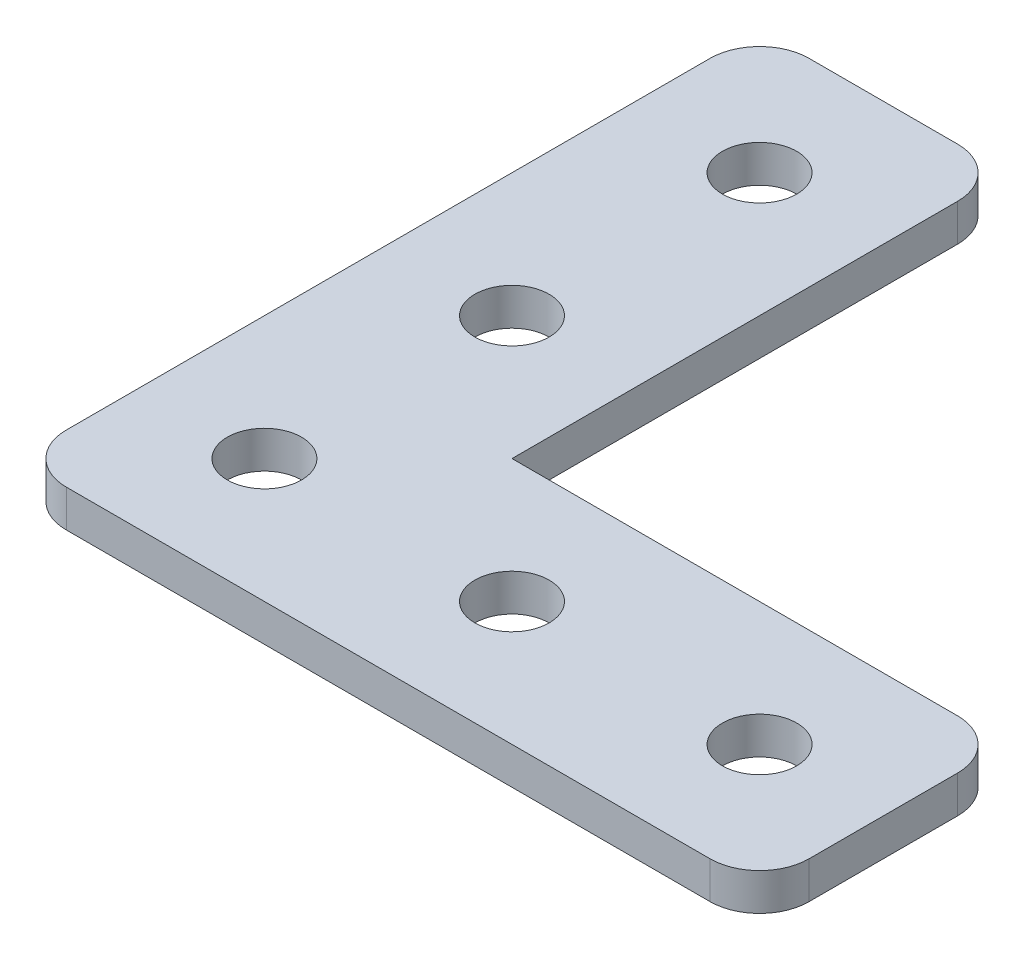
ISO-10303-21;
HEADER;
FILE_DESCRIPTION(('STEP AP214'),'2;1');
FILE_NAME('part.step','',(''),(''),'','','');
FILE_SCHEMA(('AUTOMOTIVE_DESIGN { 1 0 10303 214 1 1 1 1 }'));
ENDSEC;
DATA;
#1=APPLICATION_CONTEXT('core data for automotive mechanical design processes');
#2=APPLICATION_PROTOCOL_DEFINITION('international standard','automotive_design',2000,#1);
#3=PRODUCT_CONTEXT('',#1,'mechanical');
#4=PRODUCT('Part','Part','',(#3));
#5=PRODUCT_RELATED_PRODUCT_CATEGORY('part','',(#4));
#6=PRODUCT_DEFINITION_FORMATION('','',#4);
#7=PRODUCT_DEFINITION_CONTEXT('part definition',#1,'design');
#8=PRODUCT_DEFINITION('design','',#6,#7);
#9=PRODUCT_DEFINITION_SHAPE('','',#8);
#10=(LENGTH_UNIT() NAMED_UNIT(*) SI_UNIT(.MILLI.,.METRE.));
#11=(NAMED_UNIT(*) PLANE_ANGLE_UNIT() SI_UNIT($,.RADIAN.));
#12=(NAMED_UNIT(*) SI_UNIT($,.STERADIAN.) SOLID_ANGLE_UNIT());
#13=UNCERTAINTY_MEASURE_WITH_UNIT(LENGTH_MEASURE(1.E-05),#10,'distance_accuracy_value','');
#14=(GEOMETRIC_REPRESENTATION_CONTEXT(3) GLOBAL_UNCERTAINTY_ASSIGNED_CONTEXT((#13)) GLOBAL_UNIT_ASSIGNED_CONTEXT((#10,
#11,#12)) REPRESENTATION_CONTEXT('',''));
#15=CARTESIAN_POINT('',(0.,0.,0.));
#16=DIRECTION('',(0.,0.,1.));
#17=DIRECTION('',(1.,0.,0.));
#18=AXIS2_PLACEMENT_3D('',#15,#16,#17);
#19=CARTESIAN_POINT('',(0.,1.5,-10.));
#20=DIRECTION('',(0.,0.,-1.));
#21=DIRECTION('',(-1.,0.,0.));
#22=AXIS2_PLACEMENT_3D('',#19,#20,#21);
#23=PLANE('',#22);
#24=DIRECTION('',(1.,0.,0.));
#25=VECTOR('',#24,1.);
#26=CARTESIAN_POINT('',(0.,1.5,-10.));
#27=LINE('',#26,#25);
#28=CARTESIAN_POINT('',(10.,1.5,-10.));
#29=VERTEX_POINT('',#28);
#30=CARTESIAN_POINT('',(28.,1.5,-10.));
#31=VERTEX_POINT('',#30);
#32=EDGE_CURVE('E136',#29,#31,#27,.T.);
#33=ORIENTED_EDGE('',*,*,#32,.T.);
#34=DIRECTION('',(0.,-1.,0.));
#35=VECTOR('',#34,1.);
#36=CARTESIAN_POINT('',(28.,0.,-10.));
#37=LINE('',#36,#35);
#38=CARTESIAN_POINT('',(28.,0.,-10.));
#39=VERTEX_POINT('',#38);
#40=EDGE_CURVE('E144',#31,#39,#37,.T.);
#41=ORIENTED_EDGE('',*,*,#40,.T.);
#42=DIRECTION('',(1.,0.,0.));
#43=VECTOR('',#42,1.);
#44=CARTESIAN_POINT('',(0.,0.,-10.));
#45=LINE('',#44,#43);
#46=CARTESIAN_POINT('',(10.,0.,-10.));
#47=VERTEX_POINT('',#46);
#48=EDGE_CURVE('E143',#47,#39,#45,.T.);
#49=ORIENTED_EDGE('',*,*,#48,.F.);
#50=DIRECTION('',(0.,-1.,0.));
#51=VECTOR('',#50,1.);
#52=CARTESIAN_POINT('',(10.,1.5,-10.));
#53=LINE('',#52,#51);
#54=EDGE_CURVE('E129',#29,#47,#53,.T.);
#55=ORIENTED_EDGE('',*,*,#54,.F.);
#56=EDGE_LOOP('',(#33,#41,#49,#55));
#57=FACE_BOUND('',#56,.T.);
#58=ADVANCED_FACE('F41',(#57),#23,.T.);
#59=CARTESIAN_POINT('',(10.,1.5,0.));
#60=DIRECTION('',(1.,0.,0.));
#61=DIRECTION('',(0.,0.,-1.));
#62=AXIS2_PLACEMENT_3D('',#59,#60,#61);
#63=PLANE('',#62);
#64=DIRECTION('',(0.,0.,1.));
#65=VECTOR('',#64,1.);
#66=CARTESIAN_POINT('',(10.,0.,0.));
#67=LINE('',#66,#65);
#68=CARTESIAN_POINT('',(10.,0.,-28.));
#69=VERTEX_POINT('',#68);
#70=EDGE_CURVE('E294',#69,#47,#67,.T.);
#71=ORIENTED_EDGE('',*,*,#70,.F.);
#72=DIRECTION('',(0.,-1.,0.));
#73=VECTOR('',#72,1.);
#74=CARTESIAN_POINT('',(10.,1.5,-28.));
#75=LINE('',#74,#73);
#76=CARTESIAN_POINT('',(10.,1.5,-28.));
#77=VERTEX_POINT('',#76);
#78=EDGE_CURVE('E12',#69,#77,#75,.F.);
#79=ORIENTED_EDGE('',*,*,#78,.T.);
#80=DIRECTION('',(0.,0.,1.));
#81=VECTOR('',#80,1.);
#82=CARTESIAN_POINT('',(10.,1.5,0.));
#83=LINE('',#82,#81);
#84=EDGE_CURVE('E125',#77,#29,#83,.T.);
#85=ORIENTED_EDGE('',*,*,#84,.T.);
#86=ORIENTED_EDGE('',*,*,#54,.T.);
#87=EDGE_LOOP('',(#71,#79,#85,#86));
#88=FACE_BOUND('',#87,.T.);
#89=ADVANCED_FACE('F128',(#88),#63,.T.);
#90=CARTESIAN_POINT('',(0.,1.5,-30.));
#91=DIRECTION('',(0.,0.,1.));
#92=DIRECTION('',(1.,0.,0.));
#93=AXIS2_PLACEMENT_3D('',#90,#91,#92);
#94=PLANE('',#93);
#95=DIRECTION('',(-1.,0.,0.));
#96=VECTOR('',#95,1.);
#97=CARTESIAN_POINT('',(0.,0.,-30.));
#98=LINE('',#97,#96);
#99=CARTESIAN_POINT('',(8.,0.,-30.));
#100=VERTEX_POINT('',#99);
#101=CARTESIAN_POINT('',(2.,0.,-30.));
#102=VERTEX_POINT('',#101);
#103=EDGE_CURVE('E274',#100,#102,#98,.T.);
#104=ORIENTED_EDGE('',*,*,#103,.T.);
#105=DIRECTION('',(0.,-1.,0.));
#106=VECTOR('',#105,1.);
#107=CARTESIAN_POINT('',(2.,1.5,-30.));
#108=LINE('',#107,#106);
#109=CARTESIAN_POINT('',(2.,1.5,-30.));
#110=VERTEX_POINT('',#109);
#111=EDGE_CURVE('E49',#102,#110,#108,.F.);
#112=ORIENTED_EDGE('',*,*,#111,.T.);
#113=DIRECTION('',(-1.,0.,0.));
#114=VECTOR('',#113,1.);
#115=CARTESIAN_POINT('',(0.,1.5,-30.));
#116=LINE('',#115,#114);
#117=CARTESIAN_POINT('',(8.,1.5,-30.));
#118=VERTEX_POINT('',#117);
#119=EDGE_CURVE('E135',#118,#110,#116,.T.);
#120=ORIENTED_EDGE('',*,*,#119,.F.);
#121=DIRECTION('',(0.,-1.,0.));
#122=VECTOR('',#121,1.);
#123=CARTESIAN_POINT('',(8.,0.,-30.));
#124=LINE('',#123,#122);
#125=EDGE_CURVE('E264',#118,#100,#124,.T.);
#126=ORIENTED_EDGE('',*,*,#125,.T.);
#127=EDGE_LOOP('',(#104,#112,#120,#126));
#128=FACE_BOUND('',#127,.T.);
#129=ADVANCED_FACE('F271',(#128),#94,.F.);
#130=CARTESIAN_POINT('',(0.,1.5,0.));
#131=DIRECTION('',(1.,0.,0.));
#132=DIRECTION('',(0.,0.,-1.));
#133=AXIS2_PLACEMENT_3D('',#130,#131,#132);
#134=PLANE('',#133);
#135=DIRECTION('',(0.,0.,1.));
#136=VECTOR('',#135,1.);
#137=CARTESIAN_POINT('',(0.,0.,0.));
#138=LINE('',#137,#136);
#139=CARTESIAN_POINT('',(0.,0.,-28.));
#140=VERTEX_POINT('',#139);
#141=CARTESIAN_POINT('',(0.,0.,-2.));
#142=VERTEX_POINT('',#141);
#143=EDGE_CURVE('E285',#140,#142,#138,.T.);
#144=ORIENTED_EDGE('',*,*,#143,.T.);
#145=DIRECTION('',(0.,-1.,0.));
#146=VECTOR('',#145,1.);
#147=CARTESIAN_POINT('',(0.,1.5,-2.));
#148=LINE('',#147,#146);
#149=CARTESIAN_POINT('',(0.,1.5,-2.));
#150=VERTEX_POINT('',#149);
#151=EDGE_CURVE('E262',#142,#150,#148,.F.);
#152=ORIENTED_EDGE('',*,*,#151,.T.);
#153=DIRECTION('',(0.,0.,1.));
#154=VECTOR('',#153,1.);
#155=CARTESIAN_POINT('',(0.,1.5,0.));
#156=LINE('',#155,#154);
#157=CARTESIAN_POINT('',(0.,1.5,-28.));
#158=VERTEX_POINT('',#157);
#159=EDGE_CURVE('E192',#158,#150,#156,.T.);
#160=ORIENTED_EDGE('',*,*,#159,.F.);
#161=DIRECTION('',(0.,-1.,0.));
#162=VECTOR('',#161,1.);
#163=CARTESIAN_POINT('',(0.,1.5,-28.));
#164=LINE('',#163,#162);
#165=EDGE_CURVE('E259',#158,#140,#164,.T.);
#166=ORIENTED_EDGE('',*,*,#165,.T.);
#167=EDGE_LOOP('',(#144,#152,#160,#166));
#168=FACE_BOUND('',#167,.T.);
#169=ADVANCED_FACE('F284',(#168),#134,.F.);
#170=CARTESIAN_POINT('',(0.,1.5,0.));
#171=DIRECTION('',(0.,0.,-1.));
#172=DIRECTION('',(-1.,0.,0.));
#173=AXIS2_PLACEMENT_3D('',#170,#171,#172);
#174=PLANE('',#173);
#175=DIRECTION('',(1.,0.,0.));
#176=VECTOR('',#175,1.);
#177=CARTESIAN_POINT('',(0.,1.5,0.));
#178=LINE('',#177,#176);
#179=CARTESIAN_POINT('',(2.,1.5,0.));
#180=VERTEX_POINT('',#179);
#181=CARTESIAN_POINT('',(28.,1.5,0.));
#182=VERTEX_POINT('',#181);
#183=EDGE_CURVE('E196',#180,#182,#178,.T.);
#184=ORIENTED_EDGE('',*,*,#183,.F.);
#185=DIRECTION('',(0.,-1.,0.));
#186=VECTOR('',#185,1.);
#187=CARTESIAN_POINT('',(2.,1.5,0.));
#188=LINE('',#187,#186);
#189=CARTESIAN_POINT('',(2.,0.,0.));
#190=VERTEX_POINT('',#189);
#191=EDGE_CURVE('E251',#180,#190,#188,.T.);
#192=ORIENTED_EDGE('',*,*,#191,.T.);
#193=DIRECTION('',(1.,0.,0.));
#194=VECTOR('',#193,1.);
#195=CARTESIAN_POINT('',(0.,0.,0.));
#196=LINE('',#195,#194);
#197=CARTESIAN_POINT('',(28.,0.,0.));
#198=VERTEX_POINT('',#197);
#199=EDGE_CURVE('E291',#190,#198,#196,.T.);
#200=ORIENTED_EDGE('',*,*,#199,.T.);
#201=DIRECTION('',(0.,-1.,0.));
#202=VECTOR('',#201,1.);
#203=CARTESIAN_POINT('',(28.,1.5,0.));
#204=LINE('',#203,#202);
#205=EDGE_CURVE('E56',#198,#182,#204,.F.);
#206=ORIENTED_EDGE('',*,*,#205,.T.);
#207=EDGE_LOOP('',(#184,#192,#200,#206));
#208=FACE_BOUND('',#207,.T.);
#209=ADVANCED_FACE('F366',(#208),#174,.F.);
#210=CARTESIAN_POINT('',(15.,1.5,-5.));
#211=DIRECTION('',(0.,-1.,0.));
#212=DIRECTION('',(0.,0.,-1.));
#213=AXIS2_PLACEMENT_3D('',#210,#211,#212);
#214=CYLINDRICAL_SURFACE('',#213,1.5);
#215=CARTESIAN_POINT('',(15.,1.5,-5.));
#216=DIRECTION('',(0.,1.,0.));
#217=DIRECTION('',(0.,0.,1.));
#218=AXIS2_PLACEMENT_3D('',#215,#216,#217);
#219=CIRCLE('',#218,1.5);
#220=CARTESIAN_POINT('',(15.,1.5,-3.5));
#221=VERTEX_POINT('',#220);
#222=EDGE_CURVE('E204',#221,#221,#219,.T.);
#223=ORIENTED_EDGE('',*,*,#222,.T.);
#224=EDGE_LOOP('',(#223));
#225=FACE_BOUND('',#224,.T.);
#226=CARTESIAN_POINT('',(15.,0.,-5.));
#227=DIRECTION('',(0.,1.,0.));
#228=DIRECTION('',(0.,0.,1.));
#229=AXIS2_PLACEMENT_3D('',#226,#227,#228);
#230=CIRCLE('',#229,1.5);
#231=CARTESIAN_POINT('',(15.,0.,-3.5));
#232=VERTEX_POINT('',#231);
#233=EDGE_CURVE('E220',#232,#232,#230,.T.);
#234=ORIENTED_EDGE('',*,*,#233,.F.);
#235=EDGE_LOOP('',(#234));
#236=FACE_BOUND('',#235,.T.);
#237=ADVANCED_FACE('F316',(#225,#236),#214,.F.);
#238=CARTESIAN_POINT('',(30.,1.5,0.));
#239=DIRECTION('',(-1.,0.,0.));
#240=DIRECTION('',(0.,0.,1.));
#241=AXIS2_PLACEMENT_3D('',#238,#239,#240);
#242=PLANE('',#241);
#243=DIRECTION('',(0.,0.,-1.));
#244=VECTOR('',#243,1.);
#245=CARTESIAN_POINT('',(30.,0.,0.));
#246=LINE('',#245,#244);
#247=CARTESIAN_POINT('',(30.,0.,-2.));
#248=VERTEX_POINT('',#247);
#249=CARTESIAN_POINT('',(30.,0.,-8.));
#250=VERTEX_POINT('',#249);
#251=EDGE_CURVE('E225',#248,#250,#246,.T.);
#252=ORIENTED_EDGE('',*,*,#251,.T.);
#253=DIRECTION('',(0.,-1.,0.));
#254=VECTOR('',#253,1.);
#255=CARTESIAN_POINT('',(30.,1.5,-8.));
#256=LINE('',#255,#254);
#257=CARTESIAN_POINT('',(30.,1.5,-8.));
#258=VERTEX_POINT('',#257);
#259=EDGE_CURVE('E180',#250,#258,#256,.F.);
#260=ORIENTED_EDGE('',*,*,#259,.T.);
#261=DIRECTION('',(0.,0.,-1.));
#262=VECTOR('',#261,1.);
#263=CARTESIAN_POINT('',(30.,1.5,0.));
#264=LINE('',#263,#262);
#265=CARTESIAN_POINT('',(30.,1.5,-2.));
#266=VERTEX_POINT('',#265);
#267=EDGE_CURVE('E201',#266,#258,#264,.T.);
#268=ORIENTED_EDGE('',*,*,#267,.F.);
#269=DIRECTION('',(0.,-1.,0.));
#270=VECTOR('',#269,1.);
#271=CARTESIAN_POINT('',(30.,1.5,-2.));
#272=LINE('',#271,#270);
#273=EDGE_CURVE('E239',#266,#248,#272,.T.);
#274=ORIENTED_EDGE('',*,*,#273,.T.);
#275=EDGE_LOOP('',(#252,#260,#268,#274));
#276=FACE_BOUND('',#275,.T.);
#277=ADVANCED_FACE('F247',(#276),#242,.F.);
#278=CARTESIAN_POINT('',(5.,1.5,-5.));
#279=DIRECTION('',(0.,-1.,0.));
#280=DIRECTION('',(0.,0.,-1.));
#281=AXIS2_PLACEMENT_3D('',#278,#279,#280);
#282=CYLINDRICAL_SURFACE('',#281,1.5);
#283=CARTESIAN_POINT('',(5.,1.5,-5.));
#284=DIRECTION('',(0.,1.,0.));
#285=DIRECTION('',(0.,0.,1.));
#286=AXIS2_PLACEMENT_3D('',#283,#284,#285);
#287=CIRCLE('',#286,1.5);
#288=CARTESIAN_POINT('',(5.,1.5,-3.5));
#289=VERTEX_POINT('',#288);
#290=EDGE_CURVE('E153',#289,#289,#287,.T.);
#291=ORIENTED_EDGE('',*,*,#290,.T.);
#292=EDGE_LOOP('',(#291));
#293=FACE_BOUND('',#292,.T.);
#294=CARTESIAN_POINT('',(5.,0.,-5.));
#295=DIRECTION('',(0.,1.,0.));
#296=DIRECTION('',(0.,0.,1.));
#297=AXIS2_PLACEMENT_3D('',#294,#295,#296);
#298=CIRCLE('',#297,1.5);
#299=CARTESIAN_POINT('',(5.,0.,-3.5));
#300=VERTEX_POINT('',#299);
#301=EDGE_CURVE('E299',#300,#300,#298,.T.);
#302=ORIENTED_EDGE('',*,*,#301,.F.);
#303=EDGE_LOOP('',(#302));
#304=FACE_BOUND('',#303,.T.);
#305=ADVANCED_FACE('F339',(#293,#304),#282,.F.);
#306=CARTESIAN_POINT('',(25.,1.5,-5.));
#307=DIRECTION('',(0.,-1.,0.));
#308=DIRECTION('',(0.,0.,-1.));
#309=AXIS2_PLACEMENT_3D('',#306,#307,#308);
#310=CYLINDRICAL_SURFACE('',#309,1.5);
#311=CARTESIAN_POINT('',(25.,1.5,-5.));
#312=DIRECTION('',(0.,1.,0.));
#313=DIRECTION('',(0.,0.,1.));
#314=AXIS2_PLACEMENT_3D('',#311,#312,#313);
#315=CIRCLE('',#314,1.5);
#316=CARTESIAN_POINT('',(25.,1.5,-3.5));
#317=VERTEX_POINT('',#316);
#318=EDGE_CURVE('E158',#317,#317,#315,.T.);
#319=ORIENTED_EDGE('',*,*,#318,.T.);
#320=EDGE_LOOP('',(#319));
#321=FACE_BOUND('',#320,.T.);
#322=CARTESIAN_POINT('',(25.,0.,-5.));
#323=DIRECTION('',(0.,1.,0.));
#324=DIRECTION('',(0.,0.,1.));
#325=AXIS2_PLACEMENT_3D('',#322,#323,#324);
#326=CIRCLE('',#325,1.5);
#327=CARTESIAN_POINT('',(25.,0.,-3.5));
#328=VERTEX_POINT('',#327);
#329=EDGE_CURVE('E302',#328,#328,#326,.T.);
#330=ORIENTED_EDGE('',*,*,#329,.F.);
#331=EDGE_LOOP('',(#330));
#332=FACE_BOUND('',#331,.T.);
#333=ADVANCED_FACE('F342',(#321,#332),#310,.F.);
#334=CARTESIAN_POINT('',(5.,1.5,-25.));
#335=DIRECTION('',(0.,-1.,0.));
#336=DIRECTION('',(0.,0.,-1.));
#337=AXIS2_PLACEMENT_3D('',#334,#335,#336);
#338=CYLINDRICAL_SURFACE('',#337,1.5);
#339=CARTESIAN_POINT('',(5.,1.5,-25.));
#340=DIRECTION('',(0.,1.,0.));
#341=DIRECTION('',(0.,0.,1.));
#342=AXIS2_PLACEMENT_3D('',#339,#340,#341);
#343=CIRCLE('',#342,1.5);
#344=CARTESIAN_POINT('',(5.,1.5,-23.5));
#345=VERTEX_POINT('',#344);
#346=EDGE_CURVE('E213',#345,#345,#343,.F.);
#347=ORIENTED_EDGE('',*,*,#346,.F.);
#348=EDGE_LOOP('',(#347));
#349=FACE_BOUND('',#348,.T.);
#350=CARTESIAN_POINT('',(5.,0.,-25.));
#351=DIRECTION('',(0.,1.,0.));
#352=DIRECTION('',(0.,0.,1.));
#353=AXIS2_PLACEMENT_3D('',#350,#351,#352);
#354=CIRCLE('',#353,1.5);
#355=CARTESIAN_POINT('',(5.,0.,-23.5));
#356=VERTEX_POINT('',#355);
#357=EDGE_CURVE('E305',#356,#356,#354,.F.);
#358=ORIENTED_EDGE('',*,*,#357,.T.);
#359=EDGE_LOOP('',(#358));
#360=FACE_BOUND('',#359,.T.);
#361=ADVANCED_FACE('F327',(#349,#360),#338,.F.);
#362=CARTESIAN_POINT('',(5.,1.5,-15.));
#363=DIRECTION('',(0.,-1.,0.));
#364=DIRECTION('',(0.,0.,-1.));
#365=AXIS2_PLACEMENT_3D('',#362,#363,#364);
#366=CYLINDRICAL_SURFACE('',#365,1.5);
#367=CARTESIAN_POINT('',(5.,1.5,-15.));
#368=DIRECTION('',(0.,1.,0.));
#369=DIRECTION('',(0.,0.,1.));
#370=AXIS2_PLACEMENT_3D('',#367,#368,#369);
#371=CIRCLE('',#370,1.5);
#372=CARTESIAN_POINT('',(5.,1.5,-13.5));
#373=VERTEX_POINT('',#372);
#374=EDGE_CURVE('E145',#373,#373,#371,.F.);
#375=ORIENTED_EDGE('',*,*,#374,.F.);
#376=EDGE_LOOP('',(#375));
#377=FACE_BOUND('',#376,.T.);
#378=CARTESIAN_POINT('',(5.,0.,-15.));
#379=DIRECTION('',(0.,1.,0.));
#380=DIRECTION('',(0.,0.,1.));
#381=AXIS2_PLACEMENT_3D('',#378,#379,#380);
#382=CIRCLE('',#381,1.5);
#383=CARTESIAN_POINT('',(5.,0.,-13.5));
#384=VERTEX_POINT('',#383);
#385=EDGE_CURVE('E216',#384,#384,#382,.F.);
#386=ORIENTED_EDGE('',*,*,#385,.T.);
#387=EDGE_LOOP('',(#386));
#388=FACE_BOUND('',#387,.T.);
#389=ADVANCED_FACE('F319',(#377,#388),#366,.F.);
#390=CARTESIAN_POINT('',(0.,1.5,0.));
#391=DIRECTION('',(0.,1.,0.));
#392=DIRECTION('',(0.,0.,1.));
#393=AXIS2_PLACEMENT_3D('',#390,#391,#392);
#394=PLANE('',#393);
#395=ORIENTED_EDGE('',*,*,#346,.T.);
#396=EDGE_LOOP('',(#395));
#397=FACE_BOUND('',#396,.T.);
#398=ORIENTED_EDGE('',*,*,#318,.F.);
#399=EDGE_LOOP('',(#398));
#400=FACE_BOUND('',#399,.T.);
#401=ORIENTED_EDGE('',*,*,#290,.F.);
#402=EDGE_LOOP('',(#401));
#403=FACE_BOUND('',#402,.T.);
#404=ORIENTED_EDGE('',*,*,#267,.T.);
#405=CARTESIAN_POINT('',(28.,1.5,-8.));
#406=DIRECTION('',(0.,1.,0.));
#407=DIRECTION('',(0.,0.,1.));
#408=AXIS2_PLACEMENT_3D('',#405,#406,#407);
#409=CIRCLE('',#408,2.);
#410=EDGE_CURVE('E151',#258,#31,#409,.T.);
#411=ORIENTED_EDGE('',*,*,#410,.T.);
#412=ORIENTED_EDGE('',*,*,#32,.F.);
#413=ORIENTED_EDGE('',*,*,#84,.F.);
#414=CARTESIAN_POINT('',(8.,1.5,-28.));
#415=DIRECTION('',(0.,1.,0.));
#416=DIRECTION('',(0.,0.,1.));
#417=AXIS2_PLACEMENT_3D('',#414,#415,#416);
#418=CIRCLE('',#417,2.);
#419=EDGE_CURVE('E174',#77,#118,#418,.T.);
#420=ORIENTED_EDGE('',*,*,#419,.T.);
#421=ORIENTED_EDGE('',*,*,#119,.T.);
#422=CARTESIAN_POINT('',(2.,1.5,-28.));
#423=DIRECTION('',(0.,1.,0.));
#424=DIRECTION('',(0.,0.,1.));
#425=AXIS2_PLACEMENT_3D('',#422,#423,#424);
#426=CIRCLE('',#425,2.);
#427=EDGE_CURVE('E179',#110,#158,#426,.T.);
#428=ORIENTED_EDGE('',*,*,#427,.T.);
#429=ORIENTED_EDGE('',*,*,#159,.T.);
#430=CARTESIAN_POINT('',(2.,1.5,-2.));
#431=DIRECTION('',(0.,1.,0.));
#432=DIRECTION('',(0.,0.,1.));
#433=AXIS2_PLACEMENT_3D('',#430,#431,#432);
#434=CIRCLE('',#433,2.);
#435=EDGE_CURVE('E63',#150,#180,#434,.T.);
#436=ORIENTED_EDGE('',*,*,#435,.T.);
#437=ORIENTED_EDGE('',*,*,#183,.T.);
#438=CARTESIAN_POINT('',(28.,1.5,-2.));
#439=DIRECTION('',(0.,1.,0.));
#440=DIRECTION('',(0.,0.,1.));
#441=AXIS2_PLACEMENT_3D('',#438,#439,#440);
#442=CIRCLE('',#441,2.);
#443=EDGE_CURVE('E185',#182,#266,#442,.T.);
#444=ORIENTED_EDGE('',*,*,#443,.T.);
#445=EDGE_LOOP('',(#404,#411,#412,#413,#420,#421,#428,#429,#436,#437,#444));
#446=FACE_BOUND('',#445,.T.);
#447=ORIENTED_EDGE('',*,*,#222,.F.);
#448=EDGE_LOOP('',(#447));
#449=FACE_BOUND('',#448,.T.);
#450=ORIENTED_EDGE('',*,*,#374,.T.);
#451=EDGE_LOOP('',(#450));
#452=FACE_BOUND('',#451,.T.);
#453=ADVANCED_FACE('F148',(#397,#400,#403,#446,#449,#452),#394,.T.);
#454=CARTESIAN_POINT('',(0.,0.,0.));
#455=DIRECTION('',(0.,1.,0.));
#456=DIRECTION('',(0.,0.,1.));
#457=AXIS2_PLACEMENT_3D('',#454,#455,#456);
#458=PLANE('',#457);
#459=ORIENTED_EDGE('',*,*,#357,.F.);
#460=EDGE_LOOP('',(#459));
#461=FACE_BOUND('',#460,.T.);
#462=ORIENTED_EDGE('',*,*,#329,.T.);
#463=EDGE_LOOP('',(#462));
#464=FACE_BOUND('',#463,.T.);
#465=ORIENTED_EDGE('',*,*,#301,.T.);
#466=EDGE_LOOP('',(#465));
#467=FACE_BOUND('',#466,.T.);
#468=ORIENTED_EDGE('',*,*,#48,.T.);
#469=CARTESIAN_POINT('',(28.,0.,-8.));
#470=DIRECTION('',(0.,1.,0.));
#471=DIRECTION('',(0.,0.,1.));
#472=AXIS2_PLACEMENT_3D('',#469,#470,#471);
#473=CIRCLE('',#472,2.);
#474=EDGE_CURVE('E238',#39,#250,#473,.F.);
#475=ORIENTED_EDGE('',*,*,#474,.T.);
#476=ORIENTED_EDGE('',*,*,#251,.F.);
#477=CARTESIAN_POINT('',(28.,0.,-2.));
#478=DIRECTION('',(0.,1.,0.));
#479=DIRECTION('',(0.,0.,1.));
#480=AXIS2_PLACEMENT_3D('',#477,#478,#479);
#481=CIRCLE('',#480,2.);
#482=EDGE_CURVE('E234',#248,#198,#481,.F.);
#483=ORIENTED_EDGE('',*,*,#482,.T.);
#484=ORIENTED_EDGE('',*,*,#199,.F.);
#485=CARTESIAN_POINT('',(2.,0.,-2.));
#486=DIRECTION('',(0.,1.,0.));
#487=DIRECTION('',(0.,0.,1.));
#488=AXIS2_PLACEMENT_3D('',#485,#486,#487);
#489=CIRCLE('',#488,2.);
#490=EDGE_CURVE('E236',#190,#142,#489,.F.);
#491=ORIENTED_EDGE('',*,*,#490,.T.);
#492=ORIENTED_EDGE('',*,*,#143,.F.);
#493=CARTESIAN_POINT('',(2.,0.,-28.));
#494=DIRECTION('',(0.,1.,0.));
#495=DIRECTION('',(0.,0.,1.));
#496=AXIS2_PLACEMENT_3D('',#493,#494,#495);
#497=CIRCLE('',#496,2.);
#498=EDGE_CURVE('E232',#140,#102,#497,.F.);
#499=ORIENTED_EDGE('',*,*,#498,.T.);
#500=ORIENTED_EDGE('',*,*,#103,.F.);
#501=CARTESIAN_POINT('',(8.,0.,-28.));
#502=DIRECTION('',(0.,1.,0.));
#503=DIRECTION('',(0.,0.,1.));
#504=AXIS2_PLACEMENT_3D('',#501,#502,#503);
#505=CIRCLE('',#504,2.);
#506=EDGE_CURVE('E230',#100,#69,#505,.F.);
#507=ORIENTED_EDGE('',*,*,#506,.T.);
#508=ORIENTED_EDGE('',*,*,#70,.T.);
#509=EDGE_LOOP('',(#468,#475,#476,#483,#484,#491,#492,#499,#500,#507,#508));
#510=FACE_BOUND('',#509,.T.);
#511=ORIENTED_EDGE('',*,*,#233,.T.);
#512=EDGE_LOOP('',(#511));
#513=FACE_BOUND('',#512,.T.);
#514=ORIENTED_EDGE('',*,*,#385,.F.);
#515=EDGE_LOOP('',(#514));
#516=FACE_BOUND('',#515,.T.);
#517=ADVANCED_FACE('F288',(#461,#464,#467,#510,#513,#516),#458,.F.);
#518=CARTESIAN_POINT('',(28.,1.5,-8.));
#519=DIRECTION('',(0.,1.,0.));
#520=DIRECTION('',(0.,0.,1.));
#521=AXIS2_PLACEMENT_3D('',#518,#519,#520);
#522=CYLINDRICAL_SURFACE('',#521,2.);
#523=ORIENTED_EDGE('',*,*,#410,.F.);
#524=ORIENTED_EDGE('',*,*,#259,.F.);
#525=ORIENTED_EDGE('',*,*,#474,.F.);
#526=ORIENTED_EDGE('',*,*,#40,.F.);
#527=EDGE_LOOP('',(#523,#524,#525,#526));
#528=FACE_BOUND('',#527,.T.);
#529=ADVANCED_FACE('F250',(#528),#522,.T.);
#530=CARTESIAN_POINT('',(2.,1.5,-2.));
#531=DIRECTION('',(0.,-1.,0.));
#532=DIRECTION('',(0.,0.,-1.));
#533=AXIS2_PLACEMENT_3D('',#530,#531,#532);
#534=CYLINDRICAL_SURFACE('',#533,2.);
#535=ORIENTED_EDGE('',*,*,#435,.F.);
#536=ORIENTED_EDGE('',*,*,#151,.F.);
#537=ORIENTED_EDGE('',*,*,#490,.F.);
#538=ORIENTED_EDGE('',*,*,#191,.F.);
#539=EDGE_LOOP('',(#535,#536,#537,#538));
#540=FACE_BOUND('',#539,.T.);
#541=ADVANCED_FACE('F352',(#540),#534,.T.);
#542=CARTESIAN_POINT('',(28.,1.5,-2.));
#543=DIRECTION('',(0.,-1.,0.));
#544=DIRECTION('',(0.,0.,-1.));
#545=AXIS2_PLACEMENT_3D('',#542,#543,#544);
#546=CYLINDRICAL_SURFACE('',#545,2.);
#547=ORIENTED_EDGE('',*,*,#443,.F.);
#548=ORIENTED_EDGE('',*,*,#205,.F.);
#549=ORIENTED_EDGE('',*,*,#482,.F.);
#550=ORIENTED_EDGE('',*,*,#273,.F.);
#551=EDGE_LOOP('',(#547,#548,#549,#550));
#552=FACE_BOUND('',#551,.T.);
#553=ADVANCED_FACE('F355',(#552),#546,.T.);
#554=CARTESIAN_POINT('',(2.,1.5,-28.));
#555=DIRECTION('',(0.,-1.,0.));
#556=DIRECTION('',(0.,0.,-1.));
#557=AXIS2_PLACEMENT_3D('',#554,#555,#556);
#558=CYLINDRICAL_SURFACE('',#557,2.);
#559=ORIENTED_EDGE('',*,*,#427,.F.);
#560=ORIENTED_EDGE('',*,*,#111,.F.);
#561=ORIENTED_EDGE('',*,*,#498,.F.);
#562=ORIENTED_EDGE('',*,*,#165,.F.);
#563=EDGE_LOOP('',(#559,#560,#561,#562));
#564=FACE_BOUND('',#563,.T.);
#565=ADVANCED_FACE('F280',(#564),#558,.T.);
#566=CARTESIAN_POINT('',(8.,1.5,-28.));
#567=DIRECTION('',(0.,1.,0.));
#568=DIRECTION('',(0.,0.,1.));
#569=AXIS2_PLACEMENT_3D('',#566,#567,#568);
#570=CYLINDRICAL_SURFACE('',#569,2.);
#571=ORIENTED_EDGE('',*,*,#419,.F.);
#572=ORIENTED_EDGE('',*,*,#78,.F.);
#573=ORIENTED_EDGE('',*,*,#506,.F.);
#574=ORIENTED_EDGE('',*,*,#125,.F.);
#575=EDGE_LOOP('',(#571,#572,#573,#574));
#576=FACE_BOUND('',#575,.T.);
#577=ADVANCED_FACE('F43',(#576),#570,.T.);
#578=CLOSED_SHELL('',(#58,#89,#129,#169,#209,#237,#277,#305,#333,#361,#389,#453,#517,#529,#541,
#553,#565,#577));
#579=MANIFOLD_SOLID_BREP('B2',#578);
#580=ADVANCED_BREP_SHAPE_REPRESENTATION('',(#18,#579),#14);
#581=SHAPE_DEFINITION_REPRESENTATION(#9,#580);
ENDSEC;
END-ISO-10303-21;
